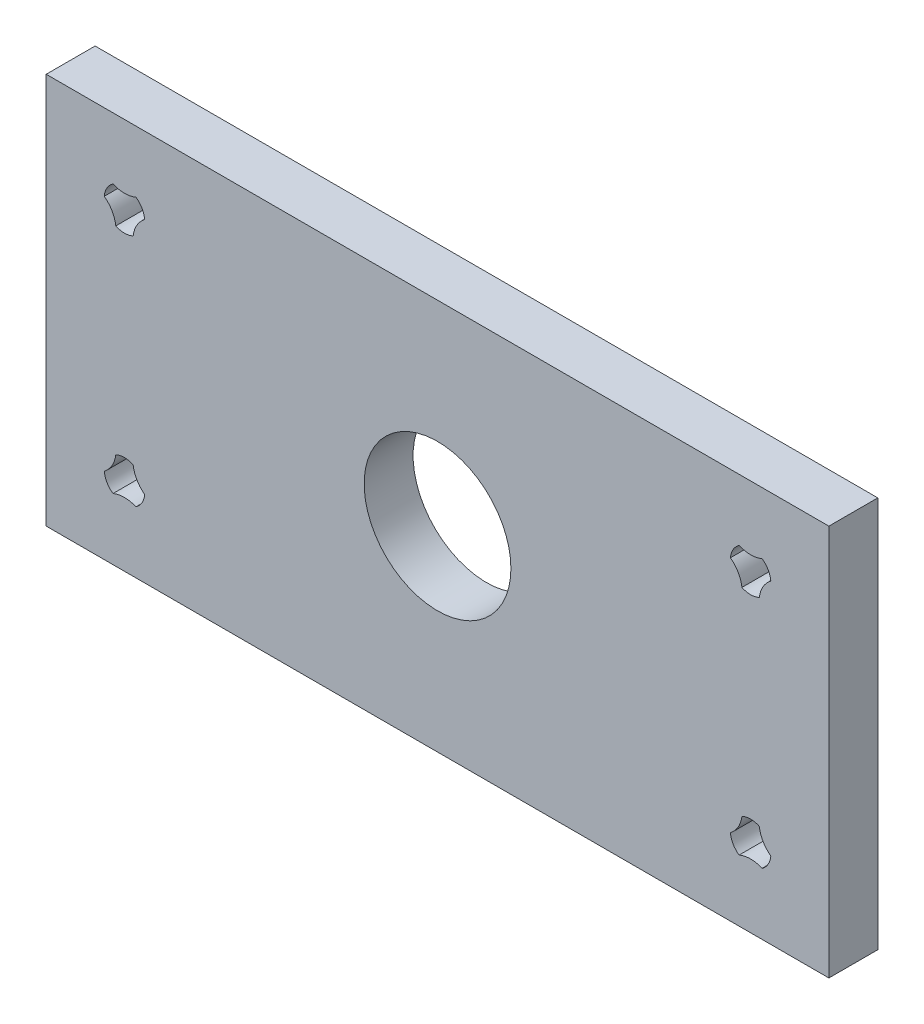
ISO-10303-21;
HEADER;
FILE_DESCRIPTION(('STEP AP214'),'2;1');
FILE_NAME('part.step','',(''),(''),'','','');
FILE_SCHEMA(('AUTOMOTIVE_DESIGN { 1 0 10303 214 1 1 1 1 }'));
ENDSEC;
DATA;
#1=APPLICATION_CONTEXT('core data for automotive mechanical design processes');
#2=APPLICATION_PROTOCOL_DEFINITION('international standard','automotive_design',2000,#1);
#3=PRODUCT_CONTEXT('',#1,'mechanical');
#4=PRODUCT('Part','Part','',(#3));
#5=PRODUCT_RELATED_PRODUCT_CATEGORY('part','',(#4));
#6=PRODUCT_DEFINITION_FORMATION('','',#4);
#7=PRODUCT_DEFINITION_CONTEXT('part definition',#1,'design');
#8=PRODUCT_DEFINITION('design','',#6,#7);
#9=PRODUCT_DEFINITION_SHAPE('','',#8);
#10=(LENGTH_UNIT() NAMED_UNIT(*) SI_UNIT(.MILLI.,.METRE.));
#11=(NAMED_UNIT(*) PLANE_ANGLE_UNIT() SI_UNIT($,.RADIAN.));
#12=(NAMED_UNIT(*) SI_UNIT($,.STERADIAN.) SOLID_ANGLE_UNIT());
#13=UNCERTAINTY_MEASURE_WITH_UNIT(LENGTH_MEASURE(1.E-05),#10,'distance_accuracy_value','');
#14=(GEOMETRIC_REPRESENTATION_CONTEXT(3) GLOBAL_UNCERTAINTY_ASSIGNED_CONTEXT((#13)) GLOBAL_UNIT_ASSIGNED_CONTEXT((#10,
#11,#12)) REPRESENTATION_CONTEXT('',''));
#15=CARTESIAN_POINT('',(0.,0.,0.));
#16=DIRECTION('',(0.,0.,1.));
#17=DIRECTION('',(1.,0.,0.));
#18=AXIS2_PLACEMENT_3D('',#15,#16,#17);
#19=CARTESIAN_POINT('',(-32.,-15.377163011483,5.));
#20=DIRECTION('',(0.,0.,-1.));
#21=DIRECTION('',(-1.,0.,0.));
#22=AXIS2_PLACEMENT_3D('',#19,#20,#21);
#23=CYLINDRICAL_SURFACE('',#22,2.06962439560808);
#24=CARTESIAN_POINT('',(-32.,-15.377163011483,0.));
#25=DIRECTION('',(0.,0.,1.));
#26=DIRECTION('',(1.,0.,0.));
#27=AXIS2_PLACEMENT_3D('',#24,#25,#26);
#28=CIRCLE('',#27,2.06962439560808);
#29=CARTESIAN_POINT('',(-29.9370940368628,-15.5437887182311,0.));
#30=VERTEX_POINT('',#29);
#31=CARTESIAN_POINT('',(-30.8242449234641,-17.0803791278042,0.));
#32=VERTEX_POINT('',#31);
#33=EDGE_CURVE('E320',#30,#32,#28,.F.);
#34=ORIENTED_EDGE('',*,*,#33,.T.);
#35=DIRECTION('',(0.,0.,-1.));
#36=VECTOR('',#35,1.);
#37=CARTESIAN_POINT('',(-30.8242449234641,-17.0803791278042,5.));
#38=LINE('',#37,#36);
#39=CARTESIAN_POINT('',(-30.8242449234641,-17.0803791278042,5.));
#40=VERTEX_POINT('',#39);
#41=EDGE_CURVE('E11',#40,#32,#38,.T.);
#42=ORIENTED_EDGE('',*,*,#41,.F.);
#43=CARTESIAN_POINT('',(-32.,-15.377163011483,5.));
#44=DIRECTION('',(0.,0.,1.));
#45=DIRECTION('',(1.,0.,0.));
#46=AXIS2_PLACEMENT_3D('',#43,#44,#45);
#47=CIRCLE('',#46,2.06962439560808);
#48=CARTESIAN_POINT('',(-29.9370940368628,-15.5437887182311,5.));
#49=VERTEX_POINT('',#48);
#50=EDGE_CURVE('E252',#49,#40,#47,.F.);
#51=ORIENTED_EDGE('',*,*,#50,.F.);
#52=DIRECTION('',(0.,0.,-1.));
#53=VECTOR('',#52,1.);
#54=CARTESIAN_POINT('',(-29.9370940368628,-15.5437887182311,5.));
#55=LINE('',#54,#53);
#56=EDGE_CURVE('E60',#49,#30,#55,.T.);
#57=ORIENTED_EDGE('',*,*,#56,.T.);
#58=EDGE_LOOP('',(#34,#42,#51,#57));
#59=FACE_BOUND('',#58,.T.);
#60=ADVANCED_FACE('F41',(#59),#23,.F.);
#61=CARTESIAN_POINT('',(-32.,-19.8403791278042,5.));
#62=DIRECTION('',(0.,0.,-1.));
#63=DIRECTION('',(-1.,0.,0.));
#64=AXIS2_PLACEMENT_3D('',#61,#62,#63);
#65=CYLINDRICAL_SURFACE('',#64,3.);
#66=CARTESIAN_POINT('',(-32.,-19.8403791278042,0.));
#67=DIRECTION('',(0.,0.,1.));
#68=DIRECTION('',(1.,0.,0.));
#69=AXIS2_PLACEMENT_3D('',#66,#67,#68);
#70=CIRCLE('',#69,3.);
#71=CARTESIAN_POINT('',(-33.1757550765359,-17.0803791278042,0.));
#72=VERTEX_POINT('',#71);
#73=EDGE_CURVE('E322',#72,#32,#70,.F.);
#74=ORIENTED_EDGE('',*,*,#73,.F.);
#75=DIRECTION('',(0.,0.,-1.));
#76=VECTOR('',#75,1.);
#77=CARTESIAN_POINT('',(-33.1757550765359,-17.0803791278042,5.));
#78=LINE('',#77,#76);
#79=CARTESIAN_POINT('',(-33.1757550765359,-17.0803791278042,5.));
#80=VERTEX_POINT('',#79);
#81=EDGE_CURVE('E51',#80,#72,#78,.T.);
#82=ORIENTED_EDGE('',*,*,#81,.F.);
#83=CARTESIAN_POINT('',(-32.,-19.8403791278042,5.));
#84=DIRECTION('',(0.,0.,1.));
#85=DIRECTION('',(1.,0.,0.));
#86=AXIS2_PLACEMENT_3D('',#83,#84,#85);
#87=CIRCLE('',#86,3.);
#88=EDGE_CURVE('E258',#80,#40,#87,.F.);
#89=ORIENTED_EDGE('',*,*,#88,.T.);
#90=ORIENTED_EDGE('',*,*,#41,.T.);
#91=EDGE_LOOP('',(#74,#82,#89,#90));
#92=FACE_BOUND('',#91,.T.);
#93=ADVANCED_FACE('F459',(#92),#65,.T.);
#94=CARTESIAN_POINT('',(-34.0629059631371,-15.5437887182311,0.));
#95=VERTEX_POINT('',#94);
#96=EDGE_CURVE('E324',#72,#95,#28,.F.);
#97=ORIENTED_EDGE('',*,*,#96,.T.);
#98=DIRECTION('',(0.,0.,-1.));
#99=VECTOR('',#98,1.);
#100=CARTESIAN_POINT('',(-34.0629059631371,-15.5437887182311,5.));
#101=LINE('',#100,#99);
#102=CARTESIAN_POINT('',(-34.0629059631371,-15.5437887182311,5.));
#103=VERTEX_POINT('',#102);
#104=EDGE_CURVE('E243',#103,#95,#101,.T.);
#105=ORIENTED_EDGE('',*,*,#104,.F.);
#106=EDGE_CURVE('E251',#80,#103,#47,.F.);
#107=ORIENTED_EDGE('',*,*,#106,.F.);
#108=ORIENTED_EDGE('',*,*,#81,.T.);
#109=EDGE_LOOP('',(#97,#105,#107,#108));
#110=FACE_BOUND('',#109,.T.);
#111=ADVANCED_FACE('F463',(#110),#23,.F.);
#112=CARTESIAN_POINT('',(-35.8652585393142,-13.1455549533225,5.));
#113=DIRECTION('',(0.,0.,-1.));
#114=DIRECTION('',(-1.,0.,0.));
#115=AXIS2_PLACEMENT_3D('',#112,#113,#114);
#116=CYLINDRICAL_SURFACE('',#115,3.);
#117=CARTESIAN_POINT('',(-35.8652585393142,-13.1455549533225,0.));
#118=DIRECTION('',(0.,0.,1.));
#119=DIRECTION('',(1.,0.,0.));
#120=AXIS2_PLACEMENT_3D('',#117,#118,#119);
#121=CIRCLE('',#120,3.);
#122=CARTESIAN_POINT('',(-32.8871508866012,-13.5073211884138,0.));
#123=VERTEX_POINT('',#122);
#124=EDGE_CURVE('E240',#123,#95,#121,.F.);
#125=ORIENTED_EDGE('',*,*,#124,.F.);
#126=DIRECTION('',(0.,0.,-1.));
#127=VECTOR('',#126,1.);
#128=CARTESIAN_POINT('',(-32.8871508866012,-13.5073211884138,5.));
#129=LINE('',#128,#127);
#130=CARTESIAN_POINT('',(-32.8871508866012,-13.5073211884138,5.));
#131=VERTEX_POINT('',#130);
#132=EDGE_CURVE('E234',#131,#123,#129,.T.);
#133=ORIENTED_EDGE('',*,*,#132,.F.);
#134=CARTESIAN_POINT('',(-35.8652585393142,-13.1455549533225,5.));
#135=DIRECTION('',(0.,0.,1.));
#136=DIRECTION('',(1.,0.,0.));
#137=AXIS2_PLACEMENT_3D('',#134,#135,#136);
#138=CIRCLE('',#137,3.);
#139=EDGE_CURVE('E238',#131,#103,#138,.F.);
#140=ORIENTED_EDGE('',*,*,#139,.T.);
#141=ORIENTED_EDGE('',*,*,#104,.T.);
#142=EDGE_LOOP('',(#125,#133,#140,#141));
#143=FACE_BOUND('',#142,.T.);
#144=ADVANCED_FACE('F236',(#143),#116,.T.);
#145=CARTESIAN_POINT('',(-31.1128491133988,-13.5073211884138,0.));
#146=VERTEX_POINT('',#145);
#147=EDGE_CURVE('E323',#123,#146,#28,.F.);
#148=ORIENTED_EDGE('',*,*,#147,.T.);
#149=DIRECTION('',(0.,0.,-1.));
#150=VECTOR('',#149,1.);
#151=CARTESIAN_POINT('',(-31.1128491133988,-13.5073211884138,5.));
#152=LINE('',#151,#150);
#153=CARTESIAN_POINT('',(-31.1128491133988,-13.5073211884138,5.));
#154=VERTEX_POINT('',#153);
#155=EDGE_CURVE('E146',#154,#146,#152,.T.);
#156=ORIENTED_EDGE('',*,*,#155,.F.);
#157=EDGE_CURVE('E245',#131,#154,#47,.F.);
#158=ORIENTED_EDGE('',*,*,#157,.F.);
#159=ORIENTED_EDGE('',*,*,#132,.T.);
#160=EDGE_LOOP('',(#148,#156,#158,#159));
#161=FACE_BOUND('',#160,.T.);
#162=ADVANCED_FACE('F246',(#161),#23,.F.);
#163=CARTESIAN_POINT('',(32.,8.62283698851697,5.));
#164=DIRECTION('',(0.,0.,-1.));
#165=DIRECTION('',(-1.,0.,0.));
#166=AXIS2_PLACEMENT_3D('',#163,#164,#165);
#167=CYLINDRICAL_SURFACE('',#166,2.06962439560808);
#168=CARTESIAN_POINT('',(32.,8.62283698851697,0.));
#169=DIRECTION('',(0.,0.,1.));
#170=DIRECTION('',(1.,0.,0.));
#171=AXIS2_PLACEMENT_3D('',#168,#169,#170);
#172=CIRCLE('',#171,2.06962439560808);
#173=CARTESIAN_POINT('',(32.8871508866012,6.75299516544777,0.));
#174=VERTEX_POINT('',#173);
#175=CARTESIAN_POINT('',(31.1128491133988,6.75299516544779,0.));
#176=VERTEX_POINT('',#175);
#177=EDGE_CURVE('E306',#174,#176,#172,.F.);
#178=ORIENTED_EDGE('',*,*,#177,.T.);
#179=DIRECTION('',(0.,0.,-1.));
#180=VECTOR('',#179,1.);
#181=CARTESIAN_POINT('',(31.1128491133988,6.75299516544779,5.));
#182=LINE('',#181,#180);
#183=CARTESIAN_POINT('',(31.1128491133988,6.75299516544779,5.));
#184=VERTEX_POINT('',#183);
#185=EDGE_CURVE('E333',#184,#176,#182,.T.);
#186=ORIENTED_EDGE('',*,*,#185,.F.);
#187=CARTESIAN_POINT('',(32.,8.62283698851697,5.));
#188=DIRECTION('',(0.,0.,1.));
#189=DIRECTION('',(1.,0.,0.));
#190=AXIS2_PLACEMENT_3D('',#187,#188,#189);
#191=CIRCLE('',#190,2.06962439560808);
#192=CARTESIAN_POINT('',(32.8871508866012,6.75299516544777,5.));
#193=VERTEX_POINT('',#192);
#194=EDGE_CURVE('E443',#193,#184,#191,.F.);
#195=ORIENTED_EDGE('',*,*,#194,.F.);
#196=DIRECTION('',(0.,0.,-1.));
#197=VECTOR('',#196,1.);
#198=CARTESIAN_POINT('',(32.8871508866012,6.75299516544777,5.));
#199=LINE('',#198,#197);
#200=EDGE_CURVE('E337',#193,#174,#199,.T.);
#201=ORIENTED_EDGE('',*,*,#200,.T.);
#202=EDGE_LOOP('',(#178,#186,#195,#201));
#203=FACE_BOUND('',#202,.T.);
#204=ADVANCED_FACE('F485',(#203),#167,.F.);
#205=CARTESIAN_POINT('',(28.1347414606858,6.39122893035641,5.));
#206=DIRECTION('',(0.,0.,-1.));
#207=DIRECTION('',(-1.,0.,0.));
#208=AXIS2_PLACEMENT_3D('',#205,#206,#207);
#209=CYLINDRICAL_SURFACE('',#208,3.);
#210=CARTESIAN_POINT('',(28.1347414606858,6.39122893035641,0.));
#211=DIRECTION('',(0.,0.,1.));
#212=DIRECTION('',(1.,0.,0.));
#213=AXIS2_PLACEMENT_3D('',#210,#211,#212);
#214=CIRCLE('',#213,3.);
#215=CARTESIAN_POINT('',(29.9370940368628,8.78946269526505,0.));
#216=VERTEX_POINT('',#215);
#217=EDGE_CURVE('E309',#216,#176,#214,.F.);
#218=ORIENTED_EDGE('',*,*,#217,.F.);
#219=DIRECTION('',(0.,0.,-1.));
#220=VECTOR('',#219,1.);
#221=CARTESIAN_POINT('',(29.9370940368628,8.78946269526505,5.));
#222=LINE('',#221,#220);
#223=CARTESIAN_POINT('',(29.9370940368628,8.78946269526505,5.));
#224=VERTEX_POINT('',#223);
#225=EDGE_CURVE('E346',#224,#216,#222,.T.);
#226=ORIENTED_EDGE('',*,*,#225,.F.);
#227=CARTESIAN_POINT('',(28.1347414606858,6.39122893035641,5.));
#228=DIRECTION('',(0.,0.,1.));
#229=DIRECTION('',(1.,0.,0.));
#230=AXIS2_PLACEMENT_3D('',#227,#228,#229);
#231=CIRCLE('',#230,3.);
#232=EDGE_CURVE('E445',#224,#184,#231,.F.);
#233=ORIENTED_EDGE('',*,*,#232,.T.);
#234=ORIENTED_EDGE('',*,*,#185,.T.);
#235=EDGE_LOOP('',(#218,#226,#233,#234));
#236=FACE_BOUND('',#235,.T.);
#237=ADVANCED_FACE('F490',(#236),#209,.T.);
#238=CARTESIAN_POINT('',(30.8242449234641,10.3260531048381,0.));
#239=VERTEX_POINT('',#238);
#240=EDGE_CURVE('E311',#216,#239,#172,.F.);
#241=ORIENTED_EDGE('',*,*,#240,.T.);
#242=DIRECTION('',(0.,0.,-1.));
#243=VECTOR('',#242,1.);
#244=CARTESIAN_POINT('',(30.8242449234641,10.3260531048381,5.));
#245=LINE('',#244,#243);
#246=CARTESIAN_POINT('',(30.8242449234641,10.3260531048381,5.));
#247=VERTEX_POINT('',#246);
#248=EDGE_CURVE('E344',#247,#239,#245,.T.);
#249=ORIENTED_EDGE('',*,*,#248,.F.);
#250=EDGE_CURVE('E447',#224,#247,#191,.F.);
#251=ORIENTED_EDGE('',*,*,#250,.F.);
#252=ORIENTED_EDGE('',*,*,#225,.T.);
#253=EDGE_LOOP('',(#241,#249,#251,#252));
#254=FACE_BOUND('',#253,.T.);
#255=ADVANCED_FACE('F493',(#254),#167,.F.);
#256=CARTESIAN_POINT('',(32.,13.0860531048381,5.));
#257=DIRECTION('',(0.,0.,-1.));
#258=DIRECTION('',(-1.,0.,0.));
#259=AXIS2_PLACEMENT_3D('',#256,#257,#258);
#260=CYLINDRICAL_SURFACE('',#259,3.);
#261=CARTESIAN_POINT('',(32.,13.0860531048381,0.));
#262=DIRECTION('',(0.,0.,1.));
#263=DIRECTION('',(1.,0.,0.));
#264=AXIS2_PLACEMENT_3D('',#261,#262,#263);
#265=CIRCLE('',#264,3.);
#266=CARTESIAN_POINT('',(33.1757550765359,10.3260531048381,0.));
#267=VERTEX_POINT('',#266);
#268=EDGE_CURVE('E314',#267,#239,#265,.F.);
#269=ORIENTED_EDGE('',*,*,#268,.F.);
#270=DIRECTION('',(0.,0.,-1.));
#271=VECTOR('',#270,1.);
#272=CARTESIAN_POINT('',(33.1757550765359,10.3260531048381,5.));
#273=LINE('',#272,#271);
#274=CARTESIAN_POINT('',(33.1757550765359,10.3260531048381,5.));
#275=VERTEX_POINT('',#274);
#276=EDGE_CURVE('E342',#275,#267,#273,.T.);
#277=ORIENTED_EDGE('',*,*,#276,.F.);
#278=CARTESIAN_POINT('',(32.,13.0860531048381,5.));
#279=DIRECTION('',(0.,0.,1.));
#280=DIRECTION('',(1.,0.,0.));
#281=AXIS2_PLACEMENT_3D('',#278,#279,#280);
#282=CIRCLE('',#281,3.);
#283=EDGE_CURVE('E450',#275,#247,#282,.F.);
#284=ORIENTED_EDGE('',*,*,#283,.T.);
#285=ORIENTED_EDGE('',*,*,#248,.T.);
#286=EDGE_LOOP('',(#269,#277,#284,#285));
#287=FACE_BOUND('',#286,.T.);
#288=ADVANCED_FACE('F505',(#287),#260,.T.);
#289=CARTESIAN_POINT('',(34.0629059631371,8.78946269526505,0.));
#290=VERTEX_POINT('',#289);
#291=EDGE_CURVE('E310',#267,#290,#172,.F.);
#292=ORIENTED_EDGE('',*,*,#291,.T.);
#293=DIRECTION('',(0.,0.,-1.));
#294=VECTOR('',#293,1.);
#295=CARTESIAN_POINT('',(34.0629059631371,8.78946269526505,5.));
#296=LINE('',#295,#294);
#297=CARTESIAN_POINT('',(34.0629059631371,8.78946269526505,5.));
#298=VERTEX_POINT('',#297);
#299=EDGE_CURVE('E339',#298,#290,#296,.T.);
#300=ORIENTED_EDGE('',*,*,#299,.F.);
#301=EDGE_CURVE('E446',#275,#298,#191,.F.);
#302=ORIENTED_EDGE('',*,*,#301,.F.);
#303=ORIENTED_EDGE('',*,*,#276,.T.);
#304=EDGE_LOOP('',(#292,#300,#302,#303));
#305=FACE_BOUND('',#304,.T.);
#306=ADVANCED_FACE('F494',(#305),#167,.F.);
#307=CARTESIAN_POINT('',(0.,-23.377163011483,5.));
#308=DIRECTION('',(0.,1.,0.));
#309=DIRECTION('',(0.,0.,1.));
#310=AXIS2_PLACEMENT_3D('',#307,#308,#309);
#311=PLANE('',#310);
#312=DIRECTION('',(1.,0.,0.));
#313=VECTOR('',#312,1.);
#314=CARTESIAN_POINT('',(0.,-23.377163011483,0.));
#315=LINE('',#314,#313);
#316=CARTESIAN_POINT('',(-40.,-23.377163011483,0.));
#317=VERTEX_POINT('',#316);
#318=CARTESIAN_POINT('',(40.,-23.377163011483,0.));
#319=VERTEX_POINT('',#318);
#320=EDGE_CURVE('E294',#317,#319,#315,.T.);
#321=ORIENTED_EDGE('',*,*,#320,.T.);
#322=DIRECTION('',(0.,0.,-1.));
#323=VECTOR('',#322,1.);
#324=CARTESIAN_POINT('',(40.,-23.377163011483,5.));
#325=LINE('',#324,#323);
#326=CARTESIAN_POINT('',(40.,-23.377163011483,5.));
#327=VERTEX_POINT('',#326);
#328=EDGE_CURVE('E340',#327,#319,#325,.T.);
#329=ORIENTED_EDGE('',*,*,#328,.F.);
#330=DIRECTION('',(1.,0.,0.));
#331=VECTOR('',#330,1.);
#332=CARTESIAN_POINT('',(0.,-23.377163011483,5.));
#333=LINE('',#332,#331);
#334=CARTESIAN_POINT('',(-40.,-23.377163011483,5.));
#335=VERTEX_POINT('',#334);
#336=EDGE_CURVE('E432',#335,#327,#333,.T.);
#337=ORIENTED_EDGE('',*,*,#336,.F.);
#338=DIRECTION('',(0.,0.,-1.));
#339=VECTOR('',#338,1.);
#340=CARTESIAN_POINT('',(-40.,-23.377163011483,5.));
#341=LINE('',#340,#339);
#342=EDGE_CURVE('E349',#335,#317,#341,.T.);
#343=ORIENTED_EDGE('',*,*,#342,.T.);
#344=EDGE_LOOP('',(#321,#329,#337,#343));
#345=FACE_BOUND('',#344,.T.);
#346=ADVANCED_FACE('F504',(#345),#311,.F.);
#347=CARTESIAN_POINT('',(40.,0.,5.));
#348=DIRECTION('',(-1.,0.,0.));
#349=DIRECTION('',(0.,-1.,0.));
#350=AXIS2_PLACEMENT_3D('',#347,#348,#349);
#351=PLANE('',#350);
#352=DIRECTION('',(0.,1.,0.));
#353=VECTOR('',#352,1.);
#354=CARTESIAN_POINT('',(40.,0.,0.));
#355=LINE('',#354,#353);
#356=CARTESIAN_POINT('',(40.,16.622836988517,0.));
#357=VERTEX_POINT('',#356);
#358=EDGE_CURVE('E297',#319,#357,#355,.T.);
#359=ORIENTED_EDGE('',*,*,#358,.T.);
#360=DIRECTION('',(0.,0.,-1.));
#361=VECTOR('',#360,1.);
#362=CARTESIAN_POINT('',(40.,16.622836988517,5.));
#363=LINE('',#362,#361);
#364=CARTESIAN_POINT('',(40.,16.622836988517,5.));
#365=VERTEX_POINT('',#364);
#366=EDGE_CURVE('E354',#365,#357,#363,.T.);
#367=ORIENTED_EDGE('',*,*,#366,.F.);
#368=DIRECTION('',(0.,1.,0.));
#369=VECTOR('',#368,1.);
#370=CARTESIAN_POINT('',(40.,0.,5.));
#371=LINE('',#370,#369);
#372=EDGE_CURVE('E435',#327,#365,#371,.T.);
#373=ORIENTED_EDGE('',*,*,#372,.F.);
#374=ORIENTED_EDGE('',*,*,#328,.T.);
#375=EDGE_LOOP('',(#359,#367,#373,#374));
#376=FACE_BOUND('',#375,.T.);
#377=ADVANCED_FACE('F521',(#376),#351,.F.);
#378=CARTESIAN_POINT('',(0.,16.622836988517,5.));
#379=DIRECTION('',(0.,1.,0.));
#380=DIRECTION('',(0.,0.,1.));
#381=AXIS2_PLACEMENT_3D('',#378,#379,#380);
#382=PLANE('',#381);
#383=DIRECTION('',(1.,0.,0.));
#384=VECTOR('',#383,1.);
#385=CARTESIAN_POINT('',(0.,16.622836988517,0.));
#386=LINE('',#385,#384);
#387=CARTESIAN_POINT('',(-40.,16.622836988517,0.));
#388=VERTEX_POINT('',#387);
#389=EDGE_CURVE('E300',#388,#357,#386,.T.);
#390=ORIENTED_EDGE('',*,*,#389,.F.);
#391=DIRECTION('',(0.,0.,-1.));
#392=VECTOR('',#391,1.);
#393=CARTESIAN_POINT('',(-40.,16.622836988517,5.));
#394=LINE('',#393,#392);
#395=CARTESIAN_POINT('',(-40.,16.622836988517,5.));
#396=VERTEX_POINT('',#395);
#397=EDGE_CURVE('E351',#396,#388,#394,.T.);
#398=ORIENTED_EDGE('',*,*,#397,.F.);
#399=DIRECTION('',(1.,0.,0.));
#400=VECTOR('',#399,1.);
#401=CARTESIAN_POINT('',(0.,16.622836988517,5.));
#402=LINE('',#401,#400);
#403=EDGE_CURVE('E437',#396,#365,#402,.T.);
#404=ORIENTED_EDGE('',*,*,#403,.T.);
#405=ORIENTED_EDGE('',*,*,#366,.T.);
#406=EDGE_LOOP('',(#390,#398,#404,#405));
#407=FACE_BOUND('',#406,.T.);
#408=ADVANCED_FACE('F517',(#407),#382,.T.);
#409=CARTESIAN_POINT('',(-32.,8.62283698851697,5.));
#410=DIRECTION('',(0.,0.,-1.));
#411=DIRECTION('',(-1.,0.,0.));
#412=AXIS2_PLACEMENT_3D('',#409,#410,#411);
#413=CYLINDRICAL_SURFACE('',#412,2.06962439560808);
#414=CARTESIAN_POINT('',(-32.,8.62283698851697,0.));
#415=DIRECTION('',(0.,0.,1.));
#416=DIRECTION('',(1.,0.,0.));
#417=AXIS2_PLACEMENT_3D('',#414,#415,#416);
#418=CIRCLE('',#417,2.06962439560808);
#419=CARTESIAN_POINT('',(-29.9370940368629,8.78946269526504,0.));
#420=VERTEX_POINT('',#419);
#421=CARTESIAN_POINT('',(-30.8242449234641,10.3260531048381,0.));
#422=VERTEX_POINT('',#421);
#423=EDGE_CURVE('E280',#420,#422,#418,.T.);
#424=ORIENTED_EDGE('',*,*,#423,.F.);
#425=DIRECTION('',(0.,0.,-1.));
#426=VECTOR('',#425,1.);
#427=CARTESIAN_POINT('',(-29.9370940368629,8.78946269526504,5.));
#428=LINE('',#427,#426);
#429=CARTESIAN_POINT('',(-29.9370940368629,8.78946269526504,5.));
#430=VERTEX_POINT('',#429);
#431=EDGE_CURVE('E352',#430,#420,#428,.T.);
#432=ORIENTED_EDGE('',*,*,#431,.F.);
#433=CARTESIAN_POINT('',(-32.,8.62283698851697,5.));
#434=DIRECTION('',(0.,0.,1.));
#435=DIRECTION('',(1.,0.,0.));
#436=AXIS2_PLACEMENT_3D('',#433,#434,#435);
#437=CIRCLE('',#436,2.06962439560808);
#438=CARTESIAN_POINT('',(-30.8242449234641,10.3260531048381,5.));
#439=VERTEX_POINT('',#438);
#440=EDGE_CURVE('E419',#430,#439,#437,.T.);
#441=ORIENTED_EDGE('',*,*,#440,.T.);
#442=DIRECTION('',(0.,0.,-1.));
#443=VECTOR('',#442,1.);
#444=CARTESIAN_POINT('',(-30.8242449234641,10.3260531048381,5.));
#445=LINE('',#444,#443);
#446=EDGE_CURVE('E358',#439,#422,#445,.T.);
#447=ORIENTED_EDGE('',*,*,#446,.T.);
#448=EDGE_LOOP('',(#424,#432,#441,#447));
#449=FACE_BOUND('',#448,.T.);
#450=ADVANCED_FACE('F520',(#449),#413,.F.);
#451=CARTESIAN_POINT('',(-28.1347414606858,6.39122893035641,5.));
#452=DIRECTION('',(0.,0.,-1.));
#453=DIRECTION('',(-1.,0.,0.));
#454=AXIS2_PLACEMENT_3D('',#451,#452,#453);
#455=CYLINDRICAL_SURFACE('',#454,3.);
#456=CARTESIAN_POINT('',(-28.1347414606858,6.39122893035641,0.));
#457=DIRECTION('',(0.,0.,1.));
#458=DIRECTION('',(1.,0.,0.));
#459=AXIS2_PLACEMENT_3D('',#456,#457,#458);
#460=CIRCLE('',#459,3.);
#461=CARTESIAN_POINT('',(-31.1128491133988,6.75299516544777,0.));
#462=VERTEX_POINT('',#461);
#463=EDGE_CURVE('E283',#420,#462,#460,.T.);
#464=ORIENTED_EDGE('',*,*,#463,.T.);
#465=DIRECTION('',(0.,0.,-1.));
#466=VECTOR('',#465,1.);
#467=CARTESIAN_POINT('',(-31.1128491133988,6.75299516544777,5.));
#468=LINE('',#467,#466);
#469=CARTESIAN_POINT('',(-31.1128491133988,6.75299516544777,5.));
#470=VERTEX_POINT('',#469);
#471=EDGE_CURVE('E366',#470,#462,#468,.T.);
#472=ORIENTED_EDGE('',*,*,#471,.F.);
#473=CARTESIAN_POINT('',(-28.1347414606858,6.39122893035641,5.));
#474=DIRECTION('',(0.,0.,1.));
#475=DIRECTION('',(1.,0.,0.));
#476=AXIS2_PLACEMENT_3D('',#473,#474,#475);
#477=CIRCLE('',#476,3.);
#478=EDGE_CURVE('E422',#430,#470,#477,.T.);
#479=ORIENTED_EDGE('',*,*,#478,.F.);
#480=ORIENTED_EDGE('',*,*,#431,.T.);
#481=EDGE_LOOP('',(#464,#472,#479,#480));
#482=FACE_BOUND('',#481,.T.);
#483=ADVANCED_FACE('F541',(#482),#455,.T.);
#484=CARTESIAN_POINT('',(-32.8871508866012,6.75299516544775,0.));
#485=VERTEX_POINT('',#484);
#486=EDGE_CURVE('E285',#485,#462,#418,.T.);
#487=ORIENTED_EDGE('',*,*,#486,.F.);
#488=DIRECTION('',(0.,0.,-1.));
#489=VECTOR('',#488,1.);
#490=CARTESIAN_POINT('',(-32.8871508866012,6.75299516544775,5.));
#491=LINE('',#490,#489);
#492=CARTESIAN_POINT('',(-32.8871508866012,6.75299516544775,5.));
#493=VERTEX_POINT('',#492);
#494=EDGE_CURVE('E364',#493,#485,#491,.T.);
#495=ORIENTED_EDGE('',*,*,#494,.F.);
#496=EDGE_CURVE('E425',#493,#470,#437,.T.);
#497=ORIENTED_EDGE('',*,*,#496,.T.);
#498=ORIENTED_EDGE('',*,*,#471,.T.);
#499=EDGE_LOOP('',(#487,#495,#497,#498));
#500=FACE_BOUND('',#499,.T.);
#501=ADVANCED_FACE('F537',(#500),#413,.F.);
#502=CARTESIAN_POINT('',(-35.8652585393142,6.39122893035644,5.));
#503=DIRECTION('',(0.,0.,-1.));
#504=DIRECTION('',(-1.,0.,0.));
#505=AXIS2_PLACEMENT_3D('',#502,#503,#504);
#506=CYLINDRICAL_SURFACE('',#505,3.);
#507=CARTESIAN_POINT('',(-35.8652585393142,6.39122893035644,0.));
#508=DIRECTION('',(0.,0.,1.));
#509=DIRECTION('',(1.,0.,0.));
#510=AXIS2_PLACEMENT_3D('',#507,#508,#509);
#511=CIRCLE('',#510,3.);
#512=CARTESIAN_POINT('',(-34.0629059631371,8.78946269526508,0.));
#513=VERTEX_POINT('',#512);
#514=EDGE_CURVE('E288',#485,#513,#511,.T.);
#515=ORIENTED_EDGE('',*,*,#514,.T.);
#516=DIRECTION('',(0.,0.,-1.));
#517=VECTOR('',#516,1.);
#518=CARTESIAN_POINT('',(-34.0629059631371,8.78946269526508,5.));
#519=LINE('',#518,#517);
#520=CARTESIAN_POINT('',(-34.0629059631371,8.78946269526508,5.));
#521=VERTEX_POINT('',#520);
#522=EDGE_CURVE('E362',#521,#513,#519,.T.);
#523=ORIENTED_EDGE('',*,*,#522,.F.);
#524=CARTESIAN_POINT('',(-35.8652585393142,6.39122893035644,5.));
#525=DIRECTION('',(0.,0.,1.));
#526=DIRECTION('',(1.,0.,0.));
#527=AXIS2_PLACEMENT_3D('',#524,#525,#526);
#528=CIRCLE('',#527,3.);
#529=EDGE_CURVE('E428',#493,#521,#528,.T.);
#530=ORIENTED_EDGE('',*,*,#529,.F.);
#531=ORIENTED_EDGE('',*,*,#494,.T.);
#532=EDGE_LOOP('',(#515,#523,#530,#531));
#533=FACE_BOUND('',#532,.T.);
#534=ADVANCED_FACE('F535',(#533),#506,.T.);
#535=CARTESIAN_POINT('',(-33.1757550765359,10.3260531048381,0.));
#536=VERTEX_POINT('',#535);
#537=EDGE_CURVE('E284',#536,#513,#418,.T.);
#538=ORIENTED_EDGE('',*,*,#537,.F.);
#539=DIRECTION('',(0.,0.,-1.));
#540=VECTOR('',#539,1.);
#541=CARTESIAN_POINT('',(-33.1757550765359,10.3260531048381,5.));
#542=LINE('',#541,#540);
#543=CARTESIAN_POINT('',(-33.1757550765359,10.3260531048381,5.));
#544=VERTEX_POINT('',#543);
#545=EDGE_CURVE('E360',#544,#536,#542,.T.);
#546=ORIENTED_EDGE('',*,*,#545,.F.);
#547=EDGE_CURVE('E424',#544,#521,#437,.T.);
#548=ORIENTED_EDGE('',*,*,#547,.T.);
#549=ORIENTED_EDGE('',*,*,#522,.T.);
#550=EDGE_LOOP('',(#538,#546,#548,#549));
#551=FACE_BOUND('',#550,.T.);
#552=ADVANCED_FACE('F532',(#551),#413,.F.);
#553=CARTESIAN_POINT('',(32.,-15.377163011483,5.));
#554=DIRECTION('',(0.,0.,-1.));
#555=DIRECTION('',(-1.,0.,0.));
#556=AXIS2_PLACEMENT_3D('',#553,#554,#555);
#557=CYLINDRICAL_SURFACE('',#556,2.06962439560808);
#558=CARTESIAN_POINT('',(32.,-15.377163011483,0.));
#559=DIRECTION('',(0.,0.,1.));
#560=DIRECTION('',(1.,0.,0.));
#561=AXIS2_PLACEMENT_3D('',#558,#559,#560);
#562=CIRCLE('',#561,2.06962439560808);
#563=CARTESIAN_POINT('',(32.8871508866012,-13.5073211884138,0.));
#564=VERTEX_POINT('',#563);
#565=CARTESIAN_POINT('',(31.1128491133988,-13.5073211884138,0.));
#566=VERTEX_POINT('',#565);
#567=EDGE_CURVE('E266',#564,#566,#562,.T.);
#568=ORIENTED_EDGE('',*,*,#567,.F.);
#569=DIRECTION('',(0.,0.,-1.));
#570=VECTOR('',#569,1.);
#571=CARTESIAN_POINT('',(32.8871508866012,-13.5073211884138,5.));
#572=LINE('',#571,#570);
#573=CARTESIAN_POINT('',(32.8871508866012,-13.5073211884138,5.));
#574=VERTEX_POINT('',#573);
#575=EDGE_CURVE('E45',#574,#564,#572,.T.);
#576=ORIENTED_EDGE('',*,*,#575,.F.);
#577=CARTESIAN_POINT('',(32.,-15.377163011483,5.));
#578=DIRECTION('',(0.,0.,1.));
#579=DIRECTION('',(1.,0.,0.));
#580=AXIS2_PLACEMENT_3D('',#577,#578,#579);
#581=CIRCLE('',#580,2.06962439560808);
#582=CARTESIAN_POINT('',(31.1128491133988,-13.5073211884138,5.));
#583=VERTEX_POINT('',#582);
#584=EDGE_CURVE('E393',#574,#583,#581,.T.);
#585=ORIENTED_EDGE('',*,*,#584,.T.);
#586=DIRECTION('',(0.,0.,-1.));
#587=VECTOR('',#586,1.);
#588=CARTESIAN_POINT('',(31.1128491133988,-13.5073211884138,5.));
#589=LINE('',#588,#587);
#590=EDGE_CURVE('E262',#583,#566,#589,.T.);
#591=ORIENTED_EDGE('',*,*,#590,.T.);
#592=EDGE_LOOP('',(#568,#576,#585,#591));
#593=FACE_BOUND('',#592,.T.);
#594=ADVANCED_FACE('F391',(#593),#557,.F.);
#595=CARTESIAN_POINT('',(35.8652585393142,-13.1455549533225,5.));
#596=DIRECTION('',(0.,0.,-1.));
#597=DIRECTION('',(-1.,0.,0.));
#598=AXIS2_PLACEMENT_3D('',#595,#596,#597);
#599=CYLINDRICAL_SURFACE('',#598,3.);
#600=CARTESIAN_POINT('',(35.8652585393142,-13.1455549533225,0.));
#601=DIRECTION('',(0.,0.,1.));
#602=DIRECTION('',(1.,0.,0.));
#603=AXIS2_PLACEMENT_3D('',#600,#601,#602);
#604=CIRCLE('',#603,3.);
#605=CARTESIAN_POINT('',(34.0629059631371,-15.5437887182311,0.));
#606=VERTEX_POINT('',#605);
#607=EDGE_CURVE('E269',#564,#606,#604,.T.);
#608=ORIENTED_EDGE('',*,*,#607,.T.);
#609=DIRECTION('',(0.,0.,-1.));
#610=VECTOR('',#609,1.);
#611=CARTESIAN_POINT('',(34.0629059631371,-15.5437887182311,5.));
#612=LINE('',#611,#610);
#613=CARTESIAN_POINT('',(34.0629059631371,-15.5437887182311,5.));
#614=VERTEX_POINT('',#613);
#615=EDGE_CURVE('E375',#614,#606,#612,.T.);
#616=ORIENTED_EDGE('',*,*,#615,.F.);
#617=CARTESIAN_POINT('',(35.8652585393142,-13.1455549533225,5.));
#618=DIRECTION('',(0.,0.,1.));
#619=DIRECTION('',(1.,0.,0.));
#620=AXIS2_PLACEMENT_3D('',#617,#618,#619);
#621=CIRCLE('',#620,3.);
#622=EDGE_CURVE('E384',#574,#614,#621,.T.);
#623=ORIENTED_EDGE('',*,*,#622,.F.);
#624=ORIENTED_EDGE('',*,*,#575,.T.);
#625=EDGE_LOOP('',(#608,#616,#623,#624));
#626=FACE_BOUND('',#625,.T.);
#627=ADVANCED_FACE('F382',(#626),#599,.T.);
#628=CARTESIAN_POINT('',(33.1757550765359,-17.0803791278042,0.));
#629=VERTEX_POINT('',#628);
#630=EDGE_CURVE('E271',#629,#606,#562,.T.);
#631=ORIENTED_EDGE('',*,*,#630,.F.);
#632=DIRECTION('',(0.,0.,-1.));
#633=VECTOR('',#632,1.);
#634=CARTESIAN_POINT('',(33.1757550765359,-17.0803791278042,5.));
#635=LINE('',#634,#633);
#636=CARTESIAN_POINT('',(33.1757550765359,-17.0803791278042,5.));
#637=VERTEX_POINT('',#636);
#638=EDGE_CURVE('E374',#637,#629,#635,.T.);
#639=ORIENTED_EDGE('',*,*,#638,.F.);
#640=EDGE_CURVE('E410',#637,#614,#581,.T.);
#641=ORIENTED_EDGE('',*,*,#640,.T.);
#642=ORIENTED_EDGE('',*,*,#615,.T.);
#643=EDGE_LOOP('',(#631,#639,#641,#642));
#644=FACE_BOUND('',#643,.T.);
#645=ADVANCED_FACE('F408',(#644),#557,.F.);
#646=CARTESIAN_POINT('',(32.,-19.8403791278042,5.));
#647=DIRECTION('',(0.,0.,-1.));
#648=DIRECTION('',(-1.,0.,0.));
#649=AXIS2_PLACEMENT_3D('',#646,#647,#648);
#650=CYLINDRICAL_SURFACE('',#649,3.);
#651=CARTESIAN_POINT('',(32.,-19.8403791278042,0.));
#652=DIRECTION('',(0.,0.,1.));
#653=DIRECTION('',(1.,0.,0.));
#654=AXIS2_PLACEMENT_3D('',#651,#652,#653);
#655=CIRCLE('',#654,3.);
#656=CARTESIAN_POINT('',(30.8242449234641,-17.0803791278042,0.));
#657=VERTEX_POINT('',#656);
#658=EDGE_CURVE('E274',#629,#657,#655,.T.);
#659=ORIENTED_EDGE('',*,*,#658,.T.);
#660=DIRECTION('',(0.,0.,-1.));
#661=VECTOR('',#660,1.);
#662=CARTESIAN_POINT('',(30.8242449234641,-17.0803791278042,5.));
#663=LINE('',#662,#661);
#664=CARTESIAN_POINT('',(30.8242449234641,-17.0803791278042,5.));
#665=VERTEX_POINT('',#664);
#666=EDGE_CURVE('E372',#665,#657,#663,.T.);
#667=ORIENTED_EDGE('',*,*,#666,.F.);
#668=CARTESIAN_POINT('',(32.,-19.8403791278042,5.));
#669=DIRECTION('',(0.,0.,1.));
#670=DIRECTION('',(1.,0.,0.));
#671=AXIS2_PLACEMENT_3D('',#668,#669,#670);
#672=CIRCLE('',#671,3.);
#673=EDGE_CURVE('E411',#637,#665,#672,.T.);
#674=ORIENTED_EDGE('',*,*,#673,.F.);
#675=ORIENTED_EDGE('',*,*,#638,.T.);
#676=EDGE_LOOP('',(#659,#667,#674,#675));
#677=FACE_BOUND('',#676,.T.);
#678=ADVANCED_FACE('F407',(#677),#650,.T.);
#679=CARTESIAN_POINT('',(29.9370940368629,-15.5437887182311,0.));
#680=VERTEX_POINT('',#679);
#681=EDGE_CURVE('E270',#680,#657,#562,.T.);
#682=ORIENTED_EDGE('',*,*,#681,.F.);
#683=DIRECTION('',(0.,0.,-1.));
#684=VECTOR('',#683,1.);
#685=CARTESIAN_POINT('',(29.9370940368629,-15.5437887182311,5.));
#686=LINE('',#685,#684);
#687=CARTESIAN_POINT('',(29.9370940368629,-15.5437887182311,5.));
#688=VERTEX_POINT('',#687);
#689=EDGE_CURVE('E370',#688,#680,#686,.T.);
#690=ORIENTED_EDGE('',*,*,#689,.F.);
#691=EDGE_CURVE('E404',#688,#665,#581,.T.);
#692=ORIENTED_EDGE('',*,*,#691,.T.);
#693=ORIENTED_EDGE('',*,*,#666,.T.);
#694=EDGE_LOOP('',(#682,#690,#692,#693));
#695=FACE_BOUND('',#694,.T.);
#696=ADVANCED_FACE('F400',(#695),#557,.F.);
#697=CARTESIAN_POINT('',(35.8652585393142,6.39122893035644,5.));
#698=DIRECTION('',(0.,0.,-1.));
#699=DIRECTION('',(-1.,0.,0.));
#700=AXIS2_PLACEMENT_3D('',#697,#698,#699);
#701=CYLINDRICAL_SURFACE('',#700,3.);
#702=CARTESIAN_POINT('',(35.8652585393142,6.39122893035644,0.));
#703=DIRECTION('',(0.,0.,1.));
#704=DIRECTION('',(1.,0.,0.));
#705=AXIS2_PLACEMENT_3D('',#702,#703,#704);
#706=CIRCLE('',#705,3.);
#707=EDGE_CURVE('E317',#174,#290,#706,.F.);
#708=ORIENTED_EDGE('',*,*,#707,.F.);
#709=ORIENTED_EDGE('',*,*,#200,.F.);
#710=CARTESIAN_POINT('',(35.8652585393142,6.39122893035644,5.));
#711=DIRECTION('',(0.,0.,1.));
#712=DIRECTION('',(1.,0.,0.));
#713=AXIS2_PLACEMENT_3D('',#710,#711,#712);
#714=CIRCLE('',#713,3.);
#715=EDGE_CURVE('E453',#193,#298,#714,.F.);
#716=ORIENTED_EDGE('',*,*,#715,.T.);
#717=ORIENTED_EDGE('',*,*,#299,.T.);
#718=EDGE_LOOP('',(#708,#709,#716,#717));
#719=FACE_BOUND('',#718,.T.);
#720=ADVANCED_FACE('F498',(#719),#701,.T.);
#721=CARTESIAN_POINT('',(-40.,0.,5.));
#722=DIRECTION('',(-1.,0.,0.));
#723=DIRECTION('',(0.,-1.,0.));
#724=AXIS2_PLACEMENT_3D('',#721,#722,#723);
#725=PLANE('',#724);
#726=DIRECTION('',(0.,1.,0.));
#727=VECTOR('',#726,1.);
#728=CARTESIAN_POINT('',(-40.,0.,0.));
#729=LINE('',#728,#727);
#730=EDGE_CURVE('E303',#317,#388,#729,.T.);
#731=ORIENTED_EDGE('',*,*,#730,.F.);
#732=ORIENTED_EDGE('',*,*,#342,.F.);
#733=DIRECTION('',(0.,1.,0.));
#734=VECTOR('',#733,1.);
#735=CARTESIAN_POINT('',(-40.,0.,5.));
#736=LINE('',#735,#734);
#737=EDGE_CURVE('E440',#335,#396,#736,.T.);
#738=ORIENTED_EDGE('',*,*,#737,.T.);
#739=ORIENTED_EDGE('',*,*,#397,.T.);
#740=EDGE_LOOP('',(#731,#732,#738,#739));
#741=FACE_BOUND('',#740,.T.);
#742=ADVANCED_FACE('F500',(#741),#725,.T.);
#743=CARTESIAN_POINT('',(-32.,13.0860531048381,5.));
#744=DIRECTION('',(0.,0.,-1.));
#745=DIRECTION('',(-1.,0.,0.));
#746=AXIS2_PLACEMENT_3D('',#743,#744,#745);
#747=CYLINDRICAL_SURFACE('',#746,3.);
#748=CARTESIAN_POINT('',(-32.,13.0860531048381,0.));
#749=DIRECTION('',(0.,0.,1.));
#750=DIRECTION('',(1.,0.,0.));
#751=AXIS2_PLACEMENT_3D('',#748,#749,#750);
#752=CIRCLE('',#751,3.);
#753=EDGE_CURVE('E291',#536,#422,#752,.T.);
#754=ORIENTED_EDGE('',*,*,#753,.T.);
#755=ORIENTED_EDGE('',*,*,#446,.F.);
#756=CARTESIAN_POINT('',(-32.,13.0860531048381,5.));
#757=DIRECTION('',(0.,0.,1.));
#758=DIRECTION('',(1.,0.,0.));
#759=AXIS2_PLACEMENT_3D('',#756,#757,#758);
#760=CIRCLE('',#759,3.);
#761=EDGE_CURVE('E430',#544,#439,#760,.T.);
#762=ORIENTED_EDGE('',*,*,#761,.F.);
#763=ORIENTED_EDGE('',*,*,#545,.T.);
#764=EDGE_LOOP('',(#754,#755,#762,#763));
#765=FACE_BOUND('',#764,.T.);
#766=ADVANCED_FACE('F515',(#765),#747,.T.);
#767=CARTESIAN_POINT('',(28.1347414606858,-13.1455549533225,5.));
#768=DIRECTION('',(0.,0.,-1.));
#769=DIRECTION('',(-1.,0.,0.));
#770=AXIS2_PLACEMENT_3D('',#767,#768,#769);
#771=CYLINDRICAL_SURFACE('',#770,3.);
#772=CARTESIAN_POINT('',(28.1347414606858,-13.1455549533225,0.));
#773=DIRECTION('',(0.,0.,1.));
#774=DIRECTION('',(1.,0.,0.));
#775=AXIS2_PLACEMENT_3D('',#772,#773,#774);
#776=CIRCLE('',#775,3.);
#777=EDGE_CURVE('E277',#680,#566,#776,.T.);
#778=ORIENTED_EDGE('',*,*,#777,.T.);
#779=ORIENTED_EDGE('',*,*,#590,.F.);
#780=CARTESIAN_POINT('',(28.1347414606858,-13.1455549533225,5.));
#781=DIRECTION('',(0.,0.,1.));
#782=DIRECTION('',(1.,0.,0.));
#783=AXIS2_PLACEMENT_3D('',#780,#781,#782);
#784=CIRCLE('',#783,3.);
#785=EDGE_CURVE('E418',#688,#583,#784,.T.);
#786=ORIENTED_EDGE('',*,*,#785,.F.);
#787=ORIENTED_EDGE('',*,*,#689,.T.);
#788=EDGE_LOOP('',(#778,#779,#786,#787));
#789=FACE_BOUND('',#788,.T.);
#790=ADVANCED_FACE('F396',(#789),#771,.T.);
#791=CARTESIAN_POINT('',(0.,-3.37716301148303,5.));
#792=DIRECTION('',(0.,0.,-1.));
#793=DIRECTION('',(-1.,0.,0.));
#794=AXIS2_PLACEMENT_3D('',#791,#792,#793);
#795=CYLINDRICAL_SURFACE('',#794,7.5);
#796=CARTESIAN_POINT('',(0.,-3.37716301148303,5.));
#797=DIRECTION('',(0.,0.,1.));
#798=DIRECTION('',(1.,0.,0.));
#799=AXIS2_PLACEMENT_3D('',#796,#797,#798);
#800=CIRCLE('',#799,7.5);
#801=CARTESIAN_POINT('',(7.5,-3.37716301148303,5.));
#802=VERTEX_POINT('',#801);
#803=EDGE_CURVE('E331',#802,#802,#800,.T.);
#804=ORIENTED_EDGE('',*,*,#803,.T.);
#805=EDGE_LOOP('',(#804));
#806=FACE_BOUND('',#805,.T.);
#807=CARTESIAN_POINT('',(0.,-3.37716301148303,0.));
#808=DIRECTION('',(0.,0.,1.));
#809=DIRECTION('',(1.,0.,0.));
#810=AXIS2_PLACEMENT_3D('',#807,#808,#809);
#811=CIRCLE('',#810,7.5);
#812=CARTESIAN_POINT('',(7.5,-3.37716301148303,0.));
#813=VERTEX_POINT('',#812);
#814=EDGE_CURVE('E263',#813,#813,#811,.T.);
#815=ORIENTED_EDGE('',*,*,#814,.F.);
#816=EDGE_LOOP('',(#815));
#817=FACE_BOUND('',#816,.T.);
#818=ADVANCED_FACE('F43',(#806,#817),#795,.F.);
#819=CARTESIAN_POINT('',(-28.1347414606858,-13.1455549533225,5.));
#820=DIRECTION('',(0.,0.,-1.));
#821=DIRECTION('',(-1.,0.,0.));
#822=AXIS2_PLACEMENT_3D('',#819,#820,#821);
#823=CYLINDRICAL_SURFACE('',#822,3.);
#824=CARTESIAN_POINT('',(-28.1347414606858,-13.1455549533225,0.));
#825=DIRECTION('',(0.,0.,1.));
#826=DIRECTION('',(1.,0.,0.));
#827=AXIS2_PLACEMENT_3D('',#824,#825,#826);
#828=CIRCLE('',#827,3.);
#829=EDGE_CURVE('E328',#30,#146,#828,.F.);
#830=ORIENTED_EDGE('',*,*,#829,.F.);
#831=ORIENTED_EDGE('',*,*,#56,.F.);
#832=CARTESIAN_POINT('',(-28.1347414606858,-13.1455549533225,5.));
#833=DIRECTION('',(0.,0.,1.));
#834=DIRECTION('',(1.,0.,0.));
#835=AXIS2_PLACEMENT_3D('',#832,#833,#834);
#836=CIRCLE('',#835,3.);
#837=EDGE_CURVE('E249',#49,#154,#836,.F.);
#838=ORIENTED_EDGE('',*,*,#837,.T.);
#839=ORIENTED_EDGE('',*,*,#155,.T.);
#840=EDGE_LOOP('',(#830,#831,#838,#839));
#841=FACE_BOUND('',#840,.T.);
#842=ADVANCED_FACE('F465',(#841),#823,.T.);
#843=CARTESIAN_POINT('',(0.,0.,5.));
#844=DIRECTION('',(0.,0.,1.));
#845=DIRECTION('',(1.,0.,0.));
#846=AXIS2_PLACEMENT_3D('',#843,#844,#845);
#847=PLANE('',#846);
#848=ORIENTED_EDGE('',*,*,#803,.F.);
#849=EDGE_LOOP('',(#848));
#850=FACE_BOUND('',#849,.T.);
#851=ORIENTED_EDGE('',*,*,#584,.F.);
#852=ORIENTED_EDGE('',*,*,#622,.T.);
#853=ORIENTED_EDGE('',*,*,#640,.F.);
#854=ORIENTED_EDGE('',*,*,#673,.T.);
#855=ORIENTED_EDGE('',*,*,#691,.F.);
#856=ORIENTED_EDGE('',*,*,#785,.T.);
#857=EDGE_LOOP('',(#851,#852,#853,#854,#855,#856));
#858=FACE_BOUND('',#857,.T.);
#859=ORIENTED_EDGE('',*,*,#440,.F.);
#860=ORIENTED_EDGE('',*,*,#478,.T.);
#861=ORIENTED_EDGE('',*,*,#496,.F.);
#862=ORIENTED_EDGE('',*,*,#529,.T.);
#863=ORIENTED_EDGE('',*,*,#547,.F.);
#864=ORIENTED_EDGE('',*,*,#761,.T.);
#865=EDGE_LOOP('',(#859,#860,#861,#862,#863,#864));
#866=FACE_BOUND('',#865,.T.);
#867=ORIENTED_EDGE('',*,*,#336,.T.);
#868=ORIENTED_EDGE('',*,*,#372,.T.);
#869=ORIENTED_EDGE('',*,*,#403,.F.);
#870=ORIENTED_EDGE('',*,*,#737,.F.);
#871=EDGE_LOOP('',(#867,#868,#869,#870));
#872=FACE_BOUND('',#871,.T.);
#873=ORIENTED_EDGE('',*,*,#194,.T.);
#874=ORIENTED_EDGE('',*,*,#232,.F.);
#875=ORIENTED_EDGE('',*,*,#250,.T.);
#876=ORIENTED_EDGE('',*,*,#283,.F.);
#877=ORIENTED_EDGE('',*,*,#301,.T.);
#878=ORIENTED_EDGE('',*,*,#715,.F.);
#879=EDGE_LOOP('',(#873,#874,#875,#876,#877,#878));
#880=FACE_BOUND('',#879,.T.);
#881=ORIENTED_EDGE('',*,*,#50,.T.);
#882=ORIENTED_EDGE('',*,*,#88,.F.);
#883=ORIENTED_EDGE('',*,*,#106,.T.);
#884=ORIENTED_EDGE('',*,*,#139,.F.);
#885=ORIENTED_EDGE('',*,*,#157,.T.);
#886=ORIENTED_EDGE('',*,*,#837,.F.);
#887=EDGE_LOOP('',(#881,#882,#883,#884,#885,#886));
#888=FACE_BOUND('',#887,.T.);
#889=ADVANCED_FACE('F253',(#850,#858,#866,#872,#880,#888),#847,.T.);
#890=CARTESIAN_POINT('',(0.,0.,0.));
#891=DIRECTION('',(0.,0.,1.));
#892=DIRECTION('',(1.,0.,0.));
#893=AXIS2_PLACEMENT_3D('',#890,#891,#892);
#894=PLANE('',#893);
#895=ORIENTED_EDGE('',*,*,#814,.T.);
#896=EDGE_LOOP('',(#895));
#897=FACE_BOUND('',#896,.T.);
#898=ORIENTED_EDGE('',*,*,#567,.T.);
#899=ORIENTED_EDGE('',*,*,#777,.F.);
#900=ORIENTED_EDGE('',*,*,#681,.T.);
#901=ORIENTED_EDGE('',*,*,#658,.F.);
#902=ORIENTED_EDGE('',*,*,#630,.T.);
#903=ORIENTED_EDGE('',*,*,#607,.F.);
#904=EDGE_LOOP('',(#898,#899,#900,#901,#902,#903));
#905=FACE_BOUND('',#904,.T.);
#906=ORIENTED_EDGE('',*,*,#423,.T.);
#907=ORIENTED_EDGE('',*,*,#753,.F.);
#908=ORIENTED_EDGE('',*,*,#537,.T.);
#909=ORIENTED_EDGE('',*,*,#514,.F.);
#910=ORIENTED_EDGE('',*,*,#486,.T.);
#911=ORIENTED_EDGE('',*,*,#463,.F.);
#912=EDGE_LOOP('',(#906,#907,#908,#909,#910,#911));
#913=FACE_BOUND('',#912,.T.);
#914=ORIENTED_EDGE('',*,*,#320,.F.);
#915=ORIENTED_EDGE('',*,*,#730,.T.);
#916=ORIENTED_EDGE('',*,*,#389,.T.);
#917=ORIENTED_EDGE('',*,*,#358,.F.);
#918=EDGE_LOOP('',(#914,#915,#916,#917));
#919=FACE_BOUND('',#918,.T.);
#920=ORIENTED_EDGE('',*,*,#177,.F.);
#921=ORIENTED_EDGE('',*,*,#707,.T.);
#922=ORIENTED_EDGE('',*,*,#291,.F.);
#923=ORIENTED_EDGE('',*,*,#268,.T.);
#924=ORIENTED_EDGE('',*,*,#240,.F.);
#925=ORIENTED_EDGE('',*,*,#217,.T.);
#926=EDGE_LOOP('',(#920,#921,#922,#923,#924,#925));
#927=FACE_BOUND('',#926,.T.);
#928=ORIENTED_EDGE('',*,*,#33,.F.);
#929=ORIENTED_EDGE('',*,*,#829,.T.);
#930=ORIENTED_EDGE('',*,*,#147,.F.);
#931=ORIENTED_EDGE('',*,*,#124,.T.);
#932=ORIENTED_EDGE('',*,*,#96,.F.);
#933=ORIENTED_EDGE('',*,*,#73,.T.);
#934=EDGE_LOOP('',(#928,#929,#930,#931,#932,#933));
#935=FACE_BOUND('',#934,.T.);
#936=ADVANCED_FACE('F387',(#897,#905,#913,#919,#927,#935),#894,.F.);
#937=CLOSED_SHELL('',(#60,#93,#111,#144,#162,#204,#237,#255,#288,#306,#346,#377,#408,#450,#483,
#501,#534,#552,#594,#627,#645,#678,#696,#720,#742,#766,#790,#818,#842,#889,#936));
#938=MANIFOLD_SOLID_BREP('B2',#937);
#939=ADVANCED_BREP_SHAPE_REPRESENTATION('',(#18,#938),#14);
#940=SHAPE_DEFINITION_REPRESENTATION(#9,#939);
ENDSEC;
END-ISO-10303-21;
